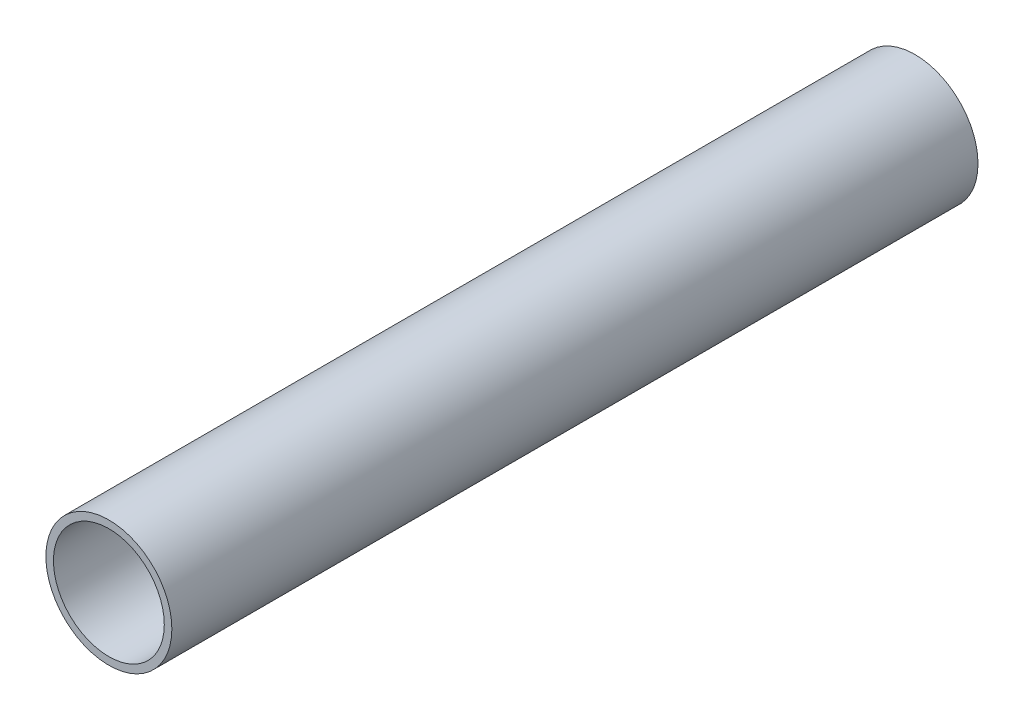
ISO-10303-21;
HEADER;
FILE_DESCRIPTION(('STEP AP214'),'2;1');
FILE_NAME('part.step','',(''),(''),'','','');
FILE_SCHEMA(('AUTOMOTIVE_DESIGN { 1 0 10303 214 1 1 1 1 }'));
ENDSEC;
DATA;
#1=APPLICATION_CONTEXT('core data for automotive mechanical design processes');
#2=APPLICATION_PROTOCOL_DEFINITION('international standard','automotive_design',2000,#1);
#3=PRODUCT_CONTEXT('',#1,'mechanical');
#4=PRODUCT('Part','Part','',(#3));
#5=PRODUCT_RELATED_PRODUCT_CATEGORY('part','',(#4));
#6=PRODUCT_DEFINITION_FORMATION('','',#4);
#7=PRODUCT_DEFINITION_CONTEXT('part definition',#1,'design');
#8=PRODUCT_DEFINITION('design','',#6,#7);
#9=PRODUCT_DEFINITION_SHAPE('','',#8);
#10=(LENGTH_UNIT() NAMED_UNIT(*) SI_UNIT(.MILLI.,.METRE.));
#11=(NAMED_UNIT(*) PLANE_ANGLE_UNIT() SI_UNIT($,.RADIAN.));
#12=(NAMED_UNIT(*) SI_UNIT($,.STERADIAN.) SOLID_ANGLE_UNIT());
#13=UNCERTAINTY_MEASURE_WITH_UNIT(LENGTH_MEASURE(1.E-05),#10,'distance_accuracy_value','');
#14=(GEOMETRIC_REPRESENTATION_CONTEXT(3) GLOBAL_UNCERTAINTY_ASSIGNED_CONTEXT((#13)) GLOBAL_UNIT_ASSIGNED_CONTEXT((#10,
#11,#12)) REPRESENTATION_CONTEXT('',''));
#15=CARTESIAN_POINT('',(0.,0.,0.));
#16=DIRECTION('',(0.,0.,1.));
#17=DIRECTION('',(1.,0.,0.));
#18=AXIS2_PLACEMENT_3D('',#15,#16,#17);
#19=CARTESIAN_POINT('',(0.,0.,812.8));
#20=DIRECTION('',(0.,0.,1.));
#21=DIRECTION('',(1.,0.,0.));
#22=AXIS2_PLACEMENT_3D('',#19,#20,#21);
#23=PLANE('',#22);
#24=CARTESIAN_POINT('',(0.,0.,812.8));
#25=DIRECTION('',(0.,0.,1.));
#26=DIRECTION('',(1.,0.,0.));
#27=AXIS2_PLACEMENT_3D('',#24,#25,#26);
#28=CIRCLE('',#27,63.5042032689877);
#29=CARTESIAN_POINT('',(63.5042032689877,0.,812.8));
#30=VERTEX_POINT('',#29);
#31=EDGE_CURVE('E10',#30,#30,#28,.T.);
#32=ORIENTED_EDGE('',*,*,#31,.T.);
#33=EDGE_LOOP('',(#32));
#34=FACE_BOUND('',#33,.T.);
#35=CARTESIAN_POINT('',(0.,0.,812.8));
#36=DIRECTION('',(0.,0.,1.));
#37=DIRECTION('',(1.,0.,0.));
#38=AXIS2_PLACEMENT_3D('',#35,#36,#37);
#39=CIRCLE('',#38,55.88);
#40=CARTESIAN_POINT('',(55.88,0.,812.8));
#41=VERTEX_POINT('',#40);
#42=EDGE_CURVE('E42',#41,#41,#39,.T.);
#43=ORIENTED_EDGE('',*,*,#42,.F.);
#44=EDGE_LOOP('',(#43));
#45=FACE_BOUND('',#44,.T.);
#46=ADVANCED_FACE('F31',(#34,#45),#23,.T.);
#47=CARTESIAN_POINT('',(0.,0.,0.));
#48=DIRECTION('',(0.,0.,1.));
#49=DIRECTION('',(1.,0.,0.));
#50=AXIS2_PLACEMENT_3D('',#47,#48,#49);
#51=PLANE('',#50);
#52=CARTESIAN_POINT('',(0.,0.,0.));
#53=DIRECTION('',(0.,0.,1.));
#54=DIRECTION('',(1.,0.,0.));
#55=AXIS2_PLACEMENT_3D('',#52,#53,#54);
#56=CIRCLE('',#55,63.5042032689877);
#57=CARTESIAN_POINT('',(63.5042032689877,0.,0.));
#58=VERTEX_POINT('',#57);
#59=EDGE_CURVE('E35',#58,#58,#56,.T.);
#60=ORIENTED_EDGE('',*,*,#59,.F.);
#61=EDGE_LOOP('',(#60));
#62=FACE_BOUND('',#61,.T.);
#63=CARTESIAN_POINT('',(0.,0.,0.));
#64=DIRECTION('',(0.,0.,1.));
#65=DIRECTION('',(1.,0.,0.));
#66=AXIS2_PLACEMENT_3D('',#63,#64,#65);
#67=CIRCLE('',#66,55.88);
#68=CARTESIAN_POINT('',(55.88,0.,0.));
#69=VERTEX_POINT('',#68);
#70=EDGE_CURVE('E44',#69,#69,#67,.T.);
#71=ORIENTED_EDGE('',*,*,#70,.T.);
#72=EDGE_LOOP('',(#71));
#73=FACE_BOUND('',#72,.T.);
#74=ADVANCED_FACE('F54',(#62,#73),#51,.F.);
#75=CARTESIAN_POINT('',(0.,0.,812.8));
#76=DIRECTION('',(0.,0.,-1.));
#77=DIRECTION('',(-1.,0.,0.));
#78=AXIS2_PLACEMENT_3D('',#75,#76,#77);
#79=CYLINDRICAL_SURFACE('',#78,63.5042032689877);
#80=ORIENTED_EDGE('',*,*,#31,.F.);
#81=EDGE_LOOP('',(#80));
#82=FACE_BOUND('',#81,.T.);
#83=ORIENTED_EDGE('',*,*,#59,.T.);
#84=EDGE_LOOP('',(#83));
#85=FACE_BOUND('',#84,.T.);
#86=ADVANCED_FACE('F33',(#82,#85),#79,.T.);
#87=CARTESIAN_POINT('',(0.,0.,812.8));
#88=DIRECTION('',(0.,0.,-1.));
#89=DIRECTION('',(-1.,0.,0.));
#90=AXIS2_PLACEMENT_3D('',#87,#88,#89);
#91=CYLINDRICAL_SURFACE('',#90,55.88);
#92=ORIENTED_EDGE('',*,*,#42,.T.);
#93=EDGE_LOOP('',(#92));
#94=FACE_BOUND('',#93,.T.);
#95=ORIENTED_EDGE('',*,*,#70,.F.);
#96=EDGE_LOOP('',(#95));
#97=FACE_BOUND('',#96,.T.);
#98=ADVANCED_FACE('F50',(#94,#97),#91,.F.);
#99=CLOSED_SHELL('',(#46,#74,#86,#98));
#100=MANIFOLD_SOLID_BREP('B2',#99);
#101=ADVANCED_BREP_SHAPE_REPRESENTATION('',(#18,#100),#14);
#102=SHAPE_DEFINITION_REPRESENTATION(#9,#101);
ENDSEC;
END-ISO-10303-21;
